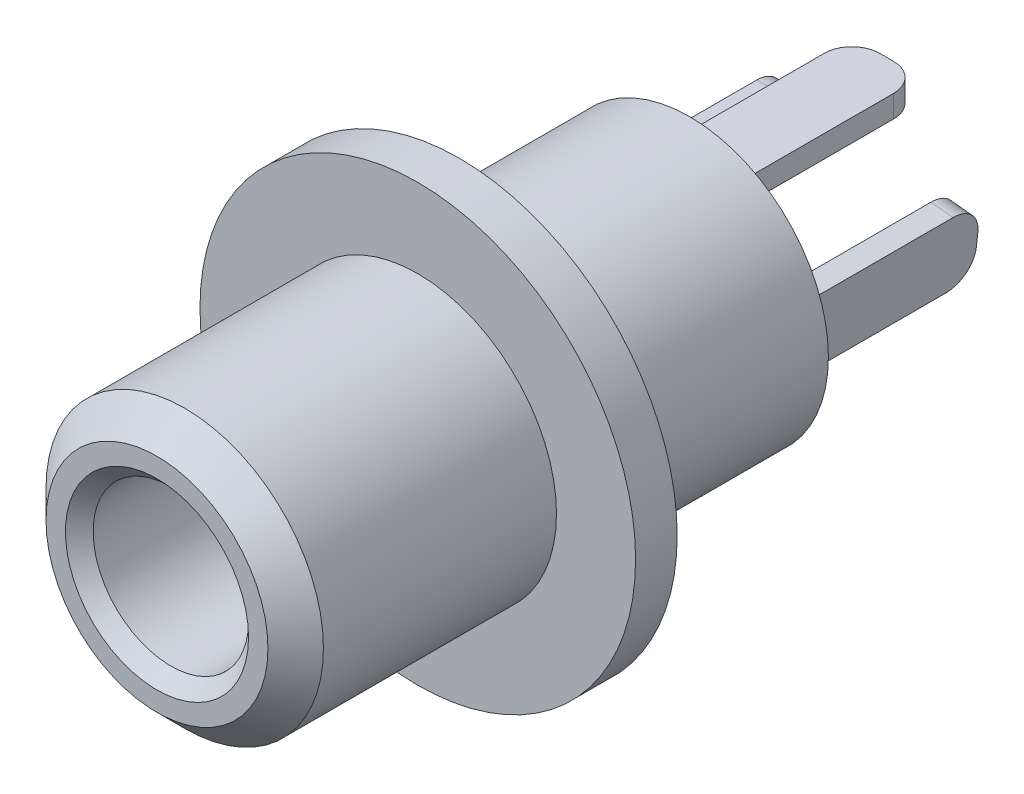
ISO-10303-21;
HEADER;
FILE_DESCRIPTION(('STEP AP214'),'2;1');
FILE_NAME('part.step','',(''),(''),'','','');
FILE_SCHEMA(('AUTOMOTIVE_DESIGN { 1 0 10303 214 1 1 1 1 }'));
ENDSEC;
DATA;
#1=APPLICATION_CONTEXT('core data for automotive mechanical design processes');
#2=APPLICATION_PROTOCOL_DEFINITION('international standard','automotive_design',2000,#1);
#3=PRODUCT_CONTEXT('',#1,'mechanical');
#4=PRODUCT('Part','Part','',(#3));
#5=PRODUCT_RELATED_PRODUCT_CATEGORY('part','',(#4));
#6=PRODUCT_DEFINITION_FORMATION('','',#4);
#7=PRODUCT_DEFINITION_CONTEXT('part definition',#1,'design');
#8=PRODUCT_DEFINITION('design','',#6,#7);
#9=PRODUCT_DEFINITION_SHAPE('','',#8);
#10=(LENGTH_UNIT() NAMED_UNIT(*) SI_UNIT(.MILLI.,.METRE.));
#11=(NAMED_UNIT(*) PLANE_ANGLE_UNIT() SI_UNIT($,.RADIAN.));
#12=(NAMED_UNIT(*) SI_UNIT($,.STERADIAN.) SOLID_ANGLE_UNIT());
#13=UNCERTAINTY_MEASURE_WITH_UNIT(LENGTH_MEASURE(1.E-05),#10,'distance_accuracy_value','');
#14=(GEOMETRIC_REPRESENTATION_CONTEXT(3) GLOBAL_UNCERTAINTY_ASSIGNED_CONTEXT((#13)) GLOBAL_UNIT_ASSIGNED_CONTEXT((#10,
#11,#12)) REPRESENTATION_CONTEXT('',''));
#15=CARTESIAN_POINT('',(0.,0.,0.));
#16=DIRECTION('',(0.,0.,1.));
#17=DIRECTION('',(1.,0.,0.));
#18=AXIS2_PLACEMENT_3D('',#15,#16,#17);
#19=CARTESIAN_POINT('',(0.,0.,4.2));
#20=DIRECTION('',(0.,0.,1.));
#21=DIRECTION('',(1.,0.,0.));
#22=AXIS2_PLACEMENT_3D('',#19,#20,#21);
#23=PLANE('',#22);
#24=CARTESIAN_POINT('',(0.,0.,4.2));
#25=DIRECTION('',(0.,0.,1.));
#26=DIRECTION('',(1.,0.,0.));
#27=AXIS2_PLACEMENT_3D('',#24,#25,#26);
#28=CIRCLE('',#27,2.8);
#29=CARTESIAN_POINT('',(2.8,0.,4.2));
#30=VERTEX_POINT('',#29);
#31=EDGE_CURVE('E179',#30,#30,#28,.T.);
#32=ORIENTED_EDGE('',*,*,#31,.T.);
#33=EDGE_LOOP('',(#32));
#34=FACE_BOUND('',#33,.T.);
#35=CARTESIAN_POINT('',(0.,0.,4.2));
#36=DIRECTION('',(0.,0.,1.));
#37=DIRECTION('',(1.,0.,0.));
#38=AXIS2_PLACEMENT_3D('',#35,#36,#37);
#39=CIRCLE('',#38,1.25);
#40=CARTESIAN_POINT('',(1.25,0.,4.2));
#41=VERTEX_POINT('',#40);
#42=EDGE_CURVE('E467',#41,#41,#39,.T.);
#43=ORIENTED_EDGE('',*,*,#42,.F.);
#44=EDGE_LOOP('',(#43));
#45=FACE_BOUND('',#44,.T.);
#46=ADVANCED_FACE('F37',(#34,#45),#23,.T.);
#47=CARTESIAN_POINT('',(0.,0.,0.));
#48=DIRECTION('',(0.,0.,1.));
#49=DIRECTION('',(1.,0.,0.));
#50=AXIS2_PLACEMENT_3D('',#47,#48,#49);
#51=PLANE('',#50);
#52=DIRECTION('',(1.,0.,0.));
#53=VECTOR('',#52,1.);
#54=CARTESIAN_POINT('',(-3.68547387231429,1.24999999999999,0.));
#55=LINE('',#54,#53);
#56=CARTESIAN_POINT('',(-3.68547387231429,1.24999999999999,0.));
#57=VERTEX_POINT('',#56);
#58=CARTESIAN_POINT('',(-2.88547387231429,1.24999999999999,0.));
#59=VERTEX_POINT('',#58);
#60=EDGE_CURVE('E195',#57,#59,#55,.T.);
#61=ORIENTED_EDGE('',*,*,#60,.F.);
#62=DIRECTION('',(0.,1.,0.));
#63=VECTOR('',#62,1.);
#64=CARTESIAN_POINT('',(-3.68547387231429,1.24999999999999,0.));
#65=LINE('',#64,#63);
#66=CARTESIAN_POINT('',(-3.68547387231429,-1.25000000000001,0.));
#67=VERTEX_POINT('',#66);
#68=EDGE_CURVE('E200',#67,#57,#65,.T.);
#69=ORIENTED_EDGE('',*,*,#68,.F.);
#70=DIRECTION('',(-1.,0.,0.));
#71=VECTOR('',#70,1.);
#72=CARTESIAN_POINT('',(-3.68547387231429,-1.25000000000001,0.));
#73=LINE('',#72,#71);
#74=CARTESIAN_POINT('',(-2.88547387231429,-1.25000000000001,0.));
#75=VERTEX_POINT('',#74);
#76=EDGE_CURVE('E209',#75,#67,#73,.T.);
#77=ORIENTED_EDGE('',*,*,#76,.F.);
#78=DIRECTION('',(0.,-1.,0.));
#79=VECTOR('',#78,1.);
#80=CARTESIAN_POINT('',(-2.88547387231429,1.24999999999999,0.));
#81=LINE('',#80,#79);
#82=EDGE_CURVE('E206',#59,#75,#81,.T.);
#83=ORIENTED_EDGE('',*,*,#82,.F.);
#84=EDGE_LOOP('',(#61,#69,#77,#83));
#85=FACE_BOUND('',#84,.T.);
#86=CARTESIAN_POINT('',(0.,0.,0.));
#87=DIRECTION('',(0.,0.,1.));
#88=DIRECTION('',(1.,0.,0.));
#89=AXIS2_PLACEMENT_3D('',#86,#87,#88);
#90=CIRCLE('',#89,5.);
#91=CARTESIAN_POINT('',(5.,0.,0.));
#92=VERTEX_POINT('',#91);
#93=EDGE_CURVE('E254',#92,#92,#90,.T.);
#94=ORIENTED_EDGE('',*,*,#93,.F.);
#95=EDGE_LOOP('',(#94));
#96=FACE_BOUND('',#95,.T.);
#97=DIRECTION('',(0.,-1.,0.));
#98=VECTOR('',#97,1.);
#99=CARTESIAN_POINT('',(1.25,3.3,0.));
#100=LINE('',#99,#98);
#101=CARTESIAN_POINT('',(1.25,3.3,0.));
#102=VERTEX_POINT('',#101);
#103=CARTESIAN_POINT('',(1.25,2.5,0.));
#104=VERTEX_POINT('',#103);
#105=EDGE_CURVE('E221',#102,#104,#100,.T.);
#106=ORIENTED_EDGE('',*,*,#105,.F.);
#107=DIRECTION('',(1.,0.,0.));
#108=VECTOR('',#107,1.);
#109=CARTESIAN_POINT('',(1.25,3.3,0.));
#110=LINE('',#109,#108);
#111=CARTESIAN_POINT('',(-1.25,3.3,0.));
#112=VERTEX_POINT('',#111);
#113=EDGE_CURVE('E226',#112,#102,#110,.T.);
#114=ORIENTED_EDGE('',*,*,#113,.F.);
#115=DIRECTION('',(0.,1.,0.));
#116=VECTOR('',#115,1.);
#117=CARTESIAN_POINT('',(-1.25,3.3,0.));
#118=LINE('',#117,#116);
#119=CARTESIAN_POINT('',(-1.25,2.5,0.));
#120=VERTEX_POINT('',#119);
#121=EDGE_CURVE('E235',#120,#112,#118,.T.);
#122=ORIENTED_EDGE('',*,*,#121,.F.);
#123=DIRECTION('',(-1.,0.,0.));
#124=VECTOR('',#123,1.);
#125=CARTESIAN_POINT('',(1.25,2.5,0.));
#126=LINE('',#125,#124);
#127=EDGE_CURVE('E232',#104,#120,#126,.T.);
#128=ORIENTED_EDGE('',*,*,#127,.F.);
#129=EDGE_LOOP('',(#106,#114,#122,#128));
#130=FACE_BOUND('',#129,.T.);
#131=DIRECTION('',(-0.994521895368273,0.104528463267653,0.));
#132=VECTOR('',#131,1.);
#133=CARTESIAN_POINT('',(3.13005934677666,-1.99266083295664,0.));
#134=LINE('',#133,#132);
#135=CARTESIAN_POINT('',(3.13005934677666,-1.99266083295664,0.));
#136=VERTEX_POINT('',#135);
#137=CARTESIAN_POINT('',(2.33444183048204,-1.90903806234252,0.));
#138=VERTEX_POINT('',#137);
#139=EDGE_CURVE('E164',#136,#138,#134,.T.);
#140=ORIENTED_EDGE('',*,*,#139,.F.);
#141=DIRECTION('',(-0.104528463267654,-0.994521895368273,0.));
#142=VECTOR('',#141,1.);
#143=CARTESIAN_POINT('',(3.13005934677666,-1.99266083295664,0.));
#144=LINE('',#143,#142);
#145=CARTESIAN_POINT('',(3.39138050494579,0.493643905464041,0.));
#146=VERTEX_POINT('',#145);
#147=EDGE_CURVE('E175',#146,#136,#144,.T.);
#148=ORIENTED_EDGE('',*,*,#147,.F.);
#149=DIRECTION('',(0.994521895368273,-0.104528463267653,0.));
#150=VECTOR('',#149,1.);
#151=CARTESIAN_POINT('',(3.39138050494579,0.493643905464041,0.));
#152=LINE('',#151,#150);
#153=CARTESIAN_POINT('',(2.59576298865117,0.577266676078164,0.));
#154=VERTEX_POINT('',#153);
#155=EDGE_CURVE('E183',#154,#146,#152,.T.);
#156=ORIENTED_EDGE('',*,*,#155,.F.);
#157=DIRECTION('',(0.104528463267654,0.994521895368273,0.));
#158=VECTOR('',#157,1.);
#159=CARTESIAN_POINT('',(2.33444183048204,-1.90903806234252,0.));
#160=LINE('',#159,#158);
#161=EDGE_CURVE('E178',#138,#154,#160,.T.);
#162=ORIENTED_EDGE('',*,*,#161,.F.);
#163=EDGE_LOOP('',(#140,#148,#156,#162));
#164=FACE_BOUND('',#163,.T.);
#165=ADVANCED_FACE('F173',(#85,#96,#130,#164),#51,.F.);
#166=CARTESIAN_POINT('',(0.,0.,9.8));
#167=DIRECTION('',(0.,0.,1.));
#168=DIRECTION('',(1.,0.,0.));
#169=AXIS2_PLACEMENT_3D('',#166,#167,#168);
#170=PLANE('',#169);
#171=CARTESIAN_POINT('',(0.,0.,9.8));
#172=DIRECTION('',(0.,0.,1.));
#173=DIRECTION('',(1.,0.,0.));
#174=AXIS2_PLACEMENT_3D('',#171,#172,#173);
#175=CIRCLE('',#174,7.85);
#176=CARTESIAN_POINT('',(7.85,0.,9.8));
#177=VERTEX_POINT('',#176);
#178=EDGE_CURVE('E250',#177,#177,#175,.T.);
#179=ORIENTED_EDGE('',*,*,#178,.T.);
#180=EDGE_LOOP('',(#179));
#181=FACE_BOUND('',#180,.T.);
#182=CARTESIAN_POINT('',(0.,0.,9.8));
#183=DIRECTION('',(0.,0.,1.));
#184=DIRECTION('',(1.,0.,0.));
#185=AXIS2_PLACEMENT_3D('',#182,#183,#184);
#186=CIRCLE('',#185,5.);
#187=CARTESIAN_POINT('',(5.,0.,9.8));
#188=VERTEX_POINT('',#187);
#189=EDGE_CURVE('E247',#188,#188,#186,.T.);
#190=ORIENTED_EDGE('',*,*,#189,.F.);
#191=EDGE_LOOP('',(#190));
#192=FACE_BOUND('',#191,.T.);
#193=ADVANCED_FACE('F340',(#181,#192),#170,.T.);
#194=CARTESIAN_POINT('',(0.,0.,9.8));
#195=DIRECTION('',(0.,0.,-1.));
#196=DIRECTION('',(-1.,0.,0.));
#197=AXIS2_PLACEMENT_3D('',#194,#195,#196);
#198=CYLINDRICAL_SURFACE('',#197,5.);
#199=ORIENTED_EDGE('',*,*,#93,.T.);
#200=EDGE_LOOP('',(#199));
#201=FACE_BOUND('',#200,.T.);
#202=CARTESIAN_POINT('',(0.,0.,8.3));
#203=DIRECTION('',(0.,0.,1.));
#204=DIRECTION('',(1.,0.,0.));
#205=AXIS2_PLACEMENT_3D('',#202,#203,#204);
#206=CIRCLE('',#205,5.);
#207=CARTESIAN_POINT('',(5.,0.,8.3));
#208=VERTEX_POINT('',#207);
#209=EDGE_CURVE('E259',#208,#208,#206,.T.);
#210=ORIENTED_EDGE('',*,*,#209,.F.);
#211=EDGE_LOOP('',(#210));
#212=FACE_BOUND('',#211,.T.);
#213=ADVANCED_FACE('F421',(#201,#212),#198,.T.);
#214=CARTESIAN_POINT('',(0.,0.,8.3));
#215=DIRECTION('',(0.,0.,1.));
#216=DIRECTION('',(1.,0.,0.));
#217=AXIS2_PLACEMENT_3D('',#214,#215,#216);
#218=PLANE('',#217);
#219=CARTESIAN_POINT('',(0.,0.,8.3));
#220=DIRECTION('',(0.,0.,1.));
#221=DIRECTION('',(1.,0.,0.));
#222=AXIS2_PLACEMENT_3D('',#219,#220,#221);
#223=CIRCLE('',#222,7.85);
#224=CARTESIAN_POINT('',(7.85,0.,8.3));
#225=VERTEX_POINT('',#224);
#226=EDGE_CURVE('E251',#225,#225,#223,.T.);
#227=ORIENTED_EDGE('',*,*,#226,.F.);
#228=EDGE_LOOP('',(#227));
#229=FACE_BOUND('',#228,.T.);
#230=ORIENTED_EDGE('',*,*,#209,.T.);
#231=EDGE_LOOP('',(#230));
#232=FACE_BOUND('',#231,.T.);
#233=ADVANCED_FACE('F418',(#229,#232),#218,.F.);
#234=CARTESIAN_POINT('',(0.,0.,8.3));
#235=DIRECTION('',(0.,0.,1.));
#236=DIRECTION('',(1.,0.,0.));
#237=AXIS2_PLACEMENT_3D('',#234,#235,#236);
#238=CYLINDRICAL_SURFACE('',#237,7.85);
#239=ORIENTED_EDGE('',*,*,#226,.T.);
#240=EDGE_LOOP('',(#239));
#241=FACE_BOUND('',#240,.T.);
#242=ORIENTED_EDGE('',*,*,#178,.F.);
#243=EDGE_LOOP('',(#242));
#244=FACE_BOUND('',#243,.T.);
#245=ADVANCED_FACE('F416',(#241,#244),#238,.T.);
#246=CARTESIAN_POINT('',(0.,0.,19.2));
#247=DIRECTION('',(0.,0.,-1.));
#248=DIRECTION('',(-1.,0.,0.));
#249=AXIS2_PLACEMENT_3D('',#246,#247,#248);
#250=CYLINDRICAL_SURFACE('',#249,5.);
#251=CARTESIAN_POINT('',(0.,0.,18.2));
#252=DIRECTION('',(0.,0.,1.));
#253=DIRECTION('',(1.,0.,0.));
#254=AXIS2_PLACEMENT_3D('',#251,#252,#253);
#255=CIRCLE('',#254,5.);
#256=CARTESIAN_POINT('',(5.,0.,18.2));
#257=VERTEX_POINT('',#256);
#258=EDGE_CURVE('E317',#257,#257,#255,.F.);
#259=ORIENTED_EDGE('',*,*,#258,.T.);
#260=EDGE_LOOP('',(#259));
#261=FACE_BOUND('',#260,.T.);
#262=ORIENTED_EDGE('',*,*,#189,.T.);
#263=EDGE_LOOP('',(#262));
#264=FACE_BOUND('',#263,.T.);
#265=ADVANCED_FACE('F412',(#261,#264),#250,.T.);
#266=CARTESIAN_POINT('',(0.,0.,19.2));
#267=DIRECTION('',(0.,0.,1.));
#268=DIRECTION('',(1.,0.,0.));
#269=AXIS2_PLACEMENT_3D('',#266,#267,#268);
#270=PLANE('',#269);
#271=CARTESIAN_POINT('',(0.,0.,19.2));
#272=DIRECTION('',(0.,0.,1.));
#273=DIRECTION('',(1.,0.,0.));
#274=AXIS2_PLACEMENT_3D('',#271,#272,#273);
#275=CIRCLE('',#274,3.3);
#276=CARTESIAN_POINT('',(3.3,0.,19.2));
#277=VERTEX_POINT('',#276);
#278=EDGE_CURVE('E11',#277,#277,#275,.F.);
#279=ORIENTED_EDGE('',*,*,#278,.T.);
#280=EDGE_LOOP('',(#279));
#281=FACE_BOUND('',#280,.T.);
#282=CARTESIAN_POINT('',(0.,0.,19.2));
#283=DIRECTION('',(0.,0.,1.));
#284=DIRECTION('',(1.,0.,0.));
#285=AXIS2_PLACEMENT_3D('',#282,#283,#284);
#286=CIRCLE('',#285,4.);
#287=CARTESIAN_POINT('',(4.,0.,19.2));
#288=VERTEX_POINT('',#287);
#289=EDGE_CURVE('E314',#288,#288,#286,.T.);
#290=ORIENTED_EDGE('',*,*,#289,.T.);
#291=EDGE_LOOP('',(#290));
#292=FACE_BOUND('',#291,.T.);
#293=ADVANCED_FACE('F408',(#281,#292),#270,.T.);
#294=CARTESIAN_POINT('',(1.25,3.3,-7.1));
#295=DIRECTION('',(-1.,0.,0.));
#296=DIRECTION('',(0.,-1.,0.));
#297=AXIS2_PLACEMENT_3D('',#294,#295,#296);
#298=PLANE('',#297);
#299=DIRECTION('',(0.,0.,1.));
#300=VECTOR('',#299,1.);
#301=CARTESIAN_POINT('',(1.25,2.5,-7.1));
#302=LINE('',#301,#300);
#303=CARTESIAN_POINT('',(1.25,2.5,-6.1));
#304=VERTEX_POINT('',#303);
#305=EDGE_CURVE('E245',#304,#104,#302,.T.);
#306=ORIENTED_EDGE('',*,*,#305,.F.);
#307=DIRECTION('',(0.,-1.,0.));
#308=VECTOR('',#307,1.);
#309=CARTESIAN_POINT('',(1.25,3.3,-6.1));
#310=LINE('',#309,#308);
#311=CARTESIAN_POINT('',(1.25,3.3,-6.1));
#312=VERTEX_POINT('',#311);
#313=EDGE_CURVE('E296',#304,#312,#310,.F.);
#314=ORIENTED_EDGE('',*,*,#313,.T.);
#315=DIRECTION('',(0.,0.,1.));
#316=VECTOR('',#315,1.);
#317=CARTESIAN_POINT('',(1.25,3.3,-7.1));
#318=LINE('',#317,#316);
#319=EDGE_CURVE('E229',#312,#102,#318,.T.);
#320=ORIENTED_EDGE('',*,*,#319,.T.);
#321=ORIENTED_EDGE('',*,*,#105,.T.);
#322=EDGE_LOOP('',(#306,#314,#320,#321));
#323=FACE_BOUND('',#322,.T.);
#324=ADVANCED_FACE('F404',(#323),#298,.F.);
#325=CARTESIAN_POINT('',(1.25,2.5,-7.1));
#326=DIRECTION('',(0.,1.,0.));
#327=DIRECTION('',(0.,0.,1.));
#328=AXIS2_PLACEMENT_3D('',#325,#326,#327);
#329=PLANE('',#328);
#330=DIRECTION('',(0.,0.,1.));
#331=VECTOR('',#330,1.);
#332=CARTESIAN_POINT('',(-1.25,2.5,-7.1));
#333=LINE('',#332,#331);
#334=CARTESIAN_POINT('',(-1.25,2.5,-6.1));
#335=VERTEX_POINT('',#334);
#336=EDGE_CURVE('E243',#335,#120,#333,.T.);
#337=ORIENTED_EDGE('',*,*,#336,.F.);
#338=CARTESIAN_POINT('',(-0.25,2.5,-6.1));
#339=DIRECTION('',(0.,1.,0.));
#340=DIRECTION('',(0.,0.,1.));
#341=AXIS2_PLACEMENT_3D('',#338,#339,#340);
#342=CIRCLE('',#341,1.);
#343=CARTESIAN_POINT('',(-0.25,2.5,-7.1));
#344=VERTEX_POINT('',#343);
#345=EDGE_CURVE('E294',#335,#344,#342,.F.);
#346=ORIENTED_EDGE('',*,*,#345,.T.);
#347=DIRECTION('',(-1.,0.,0.));
#348=VECTOR('',#347,1.);
#349=CARTESIAN_POINT('',(1.25,2.5,-7.1));
#350=LINE('',#349,#348);
#351=CARTESIAN_POINT('',(0.25,2.5,-7.1));
#352=VERTEX_POINT('',#351);
#353=EDGE_CURVE('E222',#352,#344,#350,.T.);
#354=ORIENTED_EDGE('',*,*,#353,.F.);
#355=CARTESIAN_POINT('',(0.25,2.5,-6.1));
#356=DIRECTION('',(0.,1.,0.));
#357=DIRECTION('',(0.,0.,1.));
#358=AXIS2_PLACEMENT_3D('',#355,#356,#357);
#359=CIRCLE('',#358,1.);
#360=EDGE_CURVE('E292',#352,#304,#359,.F.);
#361=ORIENTED_EDGE('',*,*,#360,.T.);
#362=ORIENTED_EDGE('',*,*,#305,.T.);
#363=ORIENTED_EDGE('',*,*,#127,.T.);
#364=EDGE_LOOP('',(#337,#346,#354,#361,#362,#363));
#365=FACE_BOUND('',#364,.T.);
#366=ADVANCED_FACE('F400',(#365),#329,.F.);
#367=CARTESIAN_POINT('',(-1.25,3.3,-7.1));
#368=DIRECTION('',(1.,0.,0.));
#369=DIRECTION('',(0.,1.,0.));
#370=AXIS2_PLACEMENT_3D('',#367,#368,#369);
#371=PLANE('',#370);
#372=DIRECTION('',(0.,0.,1.));
#373=VECTOR('',#372,1.);
#374=CARTESIAN_POINT('',(-1.25,3.3,-7.1));
#375=LINE('',#374,#373);
#376=CARTESIAN_POINT('',(-1.25,3.3,-6.1));
#377=VERTEX_POINT('',#376);
#378=EDGE_CURVE('E241',#377,#112,#375,.T.);
#379=ORIENTED_EDGE('',*,*,#378,.F.);
#380=DIRECTION('',(0.,1.,0.));
#381=VECTOR('',#380,1.);
#382=CARTESIAN_POINT('',(-1.25,2.5,-6.1));
#383=LINE('',#382,#381);
#384=EDGE_CURVE('E290',#377,#335,#383,.F.);
#385=ORIENTED_EDGE('',*,*,#384,.T.);
#386=ORIENTED_EDGE('',*,*,#336,.T.);
#387=ORIENTED_EDGE('',*,*,#121,.T.);
#388=EDGE_LOOP('',(#379,#385,#386,#387));
#389=FACE_BOUND('',#388,.T.);
#390=ADVANCED_FACE('F396',(#389),#371,.F.);
#391=CARTESIAN_POINT('',(1.25,3.3,-7.1));
#392=DIRECTION('',(0.,-1.,0.));
#393=DIRECTION('',(0.,0.,-1.));
#394=AXIS2_PLACEMENT_3D('',#391,#392,#393);
#395=PLANE('',#394);
#396=DIRECTION('',(1.,0.,0.));
#397=VECTOR('',#396,1.);
#398=CARTESIAN_POINT('',(1.25,3.3,-7.1));
#399=LINE('',#398,#397);
#400=CARTESIAN_POINT('',(-0.25,3.3,-7.1));
#401=VERTEX_POINT('',#400);
#402=CARTESIAN_POINT('',(0.25,3.3,-7.1));
#403=VERTEX_POINT('',#402);
#404=EDGE_CURVE('E225',#401,#403,#399,.T.);
#405=ORIENTED_EDGE('',*,*,#404,.F.);
#406=CARTESIAN_POINT('',(-0.25,3.3,-6.1));
#407=DIRECTION('',(0.,-1.,0.));
#408=DIRECTION('',(0.,0.,-1.));
#409=AXIS2_PLACEMENT_3D('',#406,#407,#408);
#410=CIRCLE('',#409,1.);
#411=EDGE_CURVE('E288',#401,#377,#410,.F.);
#412=ORIENTED_EDGE('',*,*,#411,.T.);
#413=ORIENTED_EDGE('',*,*,#378,.T.);
#414=ORIENTED_EDGE('',*,*,#113,.T.);
#415=ORIENTED_EDGE('',*,*,#319,.F.);
#416=CARTESIAN_POINT('',(0.25,3.3,-6.1));
#417=DIRECTION('',(0.,-1.,0.));
#418=DIRECTION('',(0.,0.,-1.));
#419=AXIS2_PLACEMENT_3D('',#416,#417,#418);
#420=CIRCLE('',#419,1.);
#421=EDGE_CURVE('E286',#312,#403,#420,.F.);
#422=ORIENTED_EDGE('',*,*,#421,.T.);
#423=EDGE_LOOP('',(#405,#412,#413,#414,#415,#422));
#424=FACE_BOUND('',#423,.T.);
#425=ADVANCED_FACE('F392',(#424),#395,.F.);
#426=CARTESIAN_POINT('',(0.,0.,-7.1));
#427=DIRECTION('',(0.,0.,-1.));
#428=DIRECTION('',(-1.,0.,0.));
#429=AXIS2_PLACEMENT_3D('',#426,#427,#428);
#430=PLANE('',#429);
#431=ORIENTED_EDGE('',*,*,#353,.T.);
#432=DIRECTION('',(0.,1.,0.));
#433=VECTOR('',#432,1.);
#434=CARTESIAN_POINT('',(-0.25,3.3,-7.1));
#435=LINE('',#434,#433);
#436=EDGE_CURVE('E283',#344,#401,#435,.T.);
#437=ORIENTED_EDGE('',*,*,#436,.T.);
#438=ORIENTED_EDGE('',*,*,#404,.T.);
#439=DIRECTION('',(0.,-1.,0.));
#440=VECTOR('',#439,1.);
#441=CARTESIAN_POINT('',(0.25,2.5,-7.1));
#442=LINE('',#441,#440);
#443=EDGE_CURVE('E280',#403,#352,#442,.T.);
#444=ORIENTED_EDGE('',*,*,#443,.T.);
#445=EDGE_LOOP('',(#431,#437,#438,#444));
#446=FACE_BOUND('',#445,.T.);
#447=ADVANCED_FACE('F388',(#446),#430,.T.);
#448=CARTESIAN_POINT('',(-3.68547387231429,1.24999999999999,-7.1));
#449=DIRECTION('',(0.,-1.,0.));
#450=DIRECTION('',(1.,0.,0.));
#451=AXIS2_PLACEMENT_3D('',#448,#449,#450);
#452=PLANE('',#451);
#453=DIRECTION('',(0.,0.,1.));
#454=VECTOR('',#453,1.);
#455=CARTESIAN_POINT('',(-2.88547387231429,1.24999999999999,-7.1));
#456=LINE('',#455,#454);
#457=CARTESIAN_POINT('',(-2.88547387231429,1.24999999999999,-6.1));
#458=VERTEX_POINT('',#457);
#459=EDGE_CURVE('E219',#458,#59,#456,.T.);
#460=ORIENTED_EDGE('',*,*,#459,.F.);
#461=DIRECTION('',(1.,0.,0.));
#462=VECTOR('',#461,1.);
#463=CARTESIAN_POINT('',(-3.68547387231429,1.24999999999999,-6.1));
#464=LINE('',#463,#462);
#465=CARTESIAN_POINT('',(-3.68547387231429,1.24999999999999,-6.1));
#466=VERTEX_POINT('',#465);
#467=EDGE_CURVE('E278',#458,#466,#464,.F.);
#468=ORIENTED_EDGE('',*,*,#467,.T.);
#469=DIRECTION('',(0.,0.,1.));
#470=VECTOR('',#469,1.);
#471=CARTESIAN_POINT('',(-3.68547387231429,1.24999999999999,-7.1));
#472=LINE('',#471,#470);
#473=EDGE_CURVE('E203',#466,#57,#472,.T.);
#474=ORIENTED_EDGE('',*,*,#473,.T.);
#475=ORIENTED_EDGE('',*,*,#60,.T.);
#476=EDGE_LOOP('',(#460,#468,#474,#475));
#477=FACE_BOUND('',#476,.T.);
#478=ADVANCED_FACE('F384',(#477),#452,.F.);
#479=CARTESIAN_POINT('',(-2.88547387231429,1.24999999999999,-7.1));
#480=DIRECTION('',(-1.,0.,0.));
#481=DIRECTION('',(0.,0.,1.));
#482=AXIS2_PLACEMENT_3D('',#479,#480,#481);
#483=PLANE('',#482);
#484=DIRECTION('',(0.,0.,1.));
#485=VECTOR('',#484,1.);
#486=CARTESIAN_POINT('',(-2.88547387231429,-1.25000000000001,-7.1));
#487=LINE('',#486,#485);
#488=CARTESIAN_POINT('',(-2.88547387231429,-1.25000000000001,-6.1));
#489=VERTEX_POINT('',#488);
#490=EDGE_CURVE('E217',#489,#75,#487,.T.);
#491=ORIENTED_EDGE('',*,*,#490,.F.);
#492=CARTESIAN_POINT('',(-2.88547387231429,-0.250000000000008,-6.1));
#493=DIRECTION('',(-1.,0.,0.));
#494=DIRECTION('',(0.,0.,1.));
#495=AXIS2_PLACEMENT_3D('',#492,#493,#494);
#496=CIRCLE('',#495,1.);
#497=CARTESIAN_POINT('',(-2.88547387231429,-0.250000000000008,-7.1));
#498=VERTEX_POINT('',#497);
#499=EDGE_CURVE('E276',#489,#498,#496,.F.);
#500=ORIENTED_EDGE('',*,*,#499,.T.);
#501=DIRECTION('',(0.,-1.,0.));
#502=VECTOR('',#501,1.);
#503=CARTESIAN_POINT('',(-2.88547387231429,1.24999999999999,-7.1));
#504=LINE('',#503,#502);
#505=CARTESIAN_POINT('',(-2.88547387231429,0.249999999999993,-7.1));
#506=VERTEX_POINT('',#505);
#507=EDGE_CURVE('E196',#506,#498,#504,.T.);
#508=ORIENTED_EDGE('',*,*,#507,.F.);
#509=CARTESIAN_POINT('',(-2.88547387231429,0.249999999999993,-6.1));
#510=DIRECTION('',(-1.,0.,0.));
#511=DIRECTION('',(0.,0.,1.));
#512=AXIS2_PLACEMENT_3D('',#509,#510,#511);
#513=CIRCLE('',#512,1.);
#514=EDGE_CURVE('E274',#506,#458,#513,.F.);
#515=ORIENTED_EDGE('',*,*,#514,.T.);
#516=ORIENTED_EDGE('',*,*,#459,.T.);
#517=ORIENTED_EDGE('',*,*,#82,.T.);
#518=EDGE_LOOP('',(#491,#500,#508,#515,#516,#517));
#519=FACE_BOUND('',#518,.T.);
#520=ADVANCED_FACE('F380',(#519),#483,.F.);
#521=CARTESIAN_POINT('',(-3.68547387231429,-1.25000000000001,-7.1));
#522=DIRECTION('',(0.,1.,0.));
#523=DIRECTION('',(0.,0.,1.));
#524=AXIS2_PLACEMENT_3D('',#521,#522,#523);
#525=PLANE('',#524);
#526=DIRECTION('',(0.,0.,1.));
#527=VECTOR('',#526,1.);
#528=CARTESIAN_POINT('',(-3.68547387231429,-1.25000000000001,-7.1));
#529=LINE('',#528,#527);
#530=CARTESIAN_POINT('',(-3.68547387231429,-1.25000000000001,-6.1));
#531=VERTEX_POINT('',#530);
#532=EDGE_CURVE('E215',#531,#67,#529,.T.);
#533=ORIENTED_EDGE('',*,*,#532,.F.);
#534=DIRECTION('',(-1.,0.,0.));
#535=VECTOR('',#534,1.);
#536=CARTESIAN_POINT('',(-2.88547387231429,-1.25000000000001,-6.1));
#537=LINE('',#536,#535);
#538=EDGE_CURVE('E272',#531,#489,#537,.F.);
#539=ORIENTED_EDGE('',*,*,#538,.T.);
#540=ORIENTED_EDGE('',*,*,#490,.T.);
#541=ORIENTED_EDGE('',*,*,#76,.T.);
#542=EDGE_LOOP('',(#533,#539,#540,#541));
#543=FACE_BOUND('',#542,.T.);
#544=ADVANCED_FACE('F376',(#543),#525,.F.);
#545=CARTESIAN_POINT('',(-3.68547387231429,1.24999999999999,-7.1));
#546=DIRECTION('',(1.,0.,0.));
#547=DIRECTION('',(0.,0.,-1.));
#548=AXIS2_PLACEMENT_3D('',#545,#546,#547);
#549=PLANE('',#548);
#550=DIRECTION('',(0.,1.,0.));
#551=VECTOR('',#550,1.);
#552=CARTESIAN_POINT('',(-3.68547387231429,1.24999999999999,-7.1));
#553=LINE('',#552,#551);
#554=CARTESIAN_POINT('',(-3.68547387231429,-0.250000000000008,-7.1));
#555=VERTEX_POINT('',#554);
#556=CARTESIAN_POINT('',(-3.68547387231429,0.249999999999993,-7.1));
#557=VERTEX_POINT('',#556);
#558=EDGE_CURVE('E199',#555,#557,#553,.T.);
#559=ORIENTED_EDGE('',*,*,#558,.F.);
#560=CARTESIAN_POINT('',(-3.68547387231429,-0.250000000000008,-6.1));
#561=DIRECTION('',(1.,0.,0.));
#562=DIRECTION('',(0.,0.,-1.));
#563=AXIS2_PLACEMENT_3D('',#560,#561,#562);
#564=CIRCLE('',#563,1.);
#565=EDGE_CURVE('E270',#555,#531,#564,.F.);
#566=ORIENTED_EDGE('',*,*,#565,.T.);
#567=ORIENTED_EDGE('',*,*,#532,.T.);
#568=ORIENTED_EDGE('',*,*,#68,.T.);
#569=ORIENTED_EDGE('',*,*,#473,.F.);
#570=CARTESIAN_POINT('',(-3.68547387231429,0.249999999999993,-6.1));
#571=DIRECTION('',(1.,0.,0.));
#572=DIRECTION('',(0.,0.,-1.));
#573=AXIS2_PLACEMENT_3D('',#570,#571,#572);
#574=CIRCLE('',#573,1.);
#575=EDGE_CURVE('E268',#466,#557,#574,.F.);
#576=ORIENTED_EDGE('',*,*,#575,.T.);
#577=EDGE_LOOP('',(#559,#566,#567,#568,#569,#576));
#578=FACE_BOUND('',#577,.T.);
#579=ADVANCED_FACE('F372',(#578),#549,.F.);
#580=CARTESIAN_POINT('',(0.,0.,-7.1));
#581=DIRECTION('',(0.,0.,-1.));
#582=DIRECTION('',(-1.,0.,0.));
#583=AXIS2_PLACEMENT_3D('',#580,#581,#582);
#584=PLANE('',#583);
#585=ORIENTED_EDGE('',*,*,#507,.T.);
#586=DIRECTION('',(-1.,0.,0.));
#587=VECTOR('',#586,1.);
#588=CARTESIAN_POINT('',(-3.68547387231429,-0.250000000000008,-7.1));
#589=LINE('',#588,#587);
#590=EDGE_CURVE('E265',#498,#555,#589,.T.);
#591=ORIENTED_EDGE('',*,*,#590,.T.);
#592=ORIENTED_EDGE('',*,*,#558,.T.);
#593=DIRECTION('',(1.,0.,0.));
#594=VECTOR('',#593,1.);
#595=CARTESIAN_POINT('',(-2.88547387231429,0.249999999999993,-7.1));
#596=LINE('',#595,#594);
#597=EDGE_CURVE('E262',#557,#506,#596,.T.);
#598=ORIENTED_EDGE('',*,*,#597,.T.);
#599=EDGE_LOOP('',(#585,#591,#592,#598));
#600=FACE_BOUND('',#599,.T.);
#601=ADVANCED_FACE('F369',(#600),#584,.T.);
#602=CARTESIAN_POINT('',(3.13005934677666,-1.99266083295664,-7.1));
#603=DIRECTION('',(0.104528463267653,0.994521895368273,0.));
#604=DIRECTION('',(-0.994521895368273,0.104528463267653,0.));
#605=AXIS2_PLACEMENT_3D('',#602,#603,#604);
#606=PLANE('',#605);
#607=DIRECTION('',(0.,0.,1.));
#608=VECTOR('',#607,1.);
#609=CARTESIAN_POINT('',(2.33444183048204,-1.90903806234252,-7.1));
#610=LINE('',#609,#608);
#611=CARTESIAN_POINT('',(2.33444183048204,-1.90903806234252,-6.1));
#612=VERTEX_POINT('',#611);
#613=EDGE_CURVE('E193',#612,#138,#610,.T.);
#614=ORIENTED_EDGE('',*,*,#613,.F.);
#615=DIRECTION('',(-0.994521895368273,0.104528463267653,0.));
#616=VECTOR('',#615,1.);
#617=CARTESIAN_POINT('',(3.13005934677666,-1.99266083295664,-6.1));
#618=LINE('',#617,#616);
#619=CARTESIAN_POINT('',(3.13005934677666,-1.99266083295664,-6.1));
#620=VERTEX_POINT('',#619);
#621=EDGE_CURVE('E60',#612,#620,#618,.F.);
#622=ORIENTED_EDGE('',*,*,#621,.T.);
#623=DIRECTION('',(0.,0.,1.));
#624=VECTOR('',#623,1.);
#625=CARTESIAN_POINT('',(3.13005934677666,-1.99266083295664,-7.1));
#626=LINE('',#625,#624);
#627=EDGE_CURVE('E161',#620,#136,#626,.T.);
#628=ORIENTED_EDGE('',*,*,#627,.T.);
#629=ORIENTED_EDGE('',*,*,#139,.T.);
#630=EDGE_LOOP('',(#614,#622,#628,#629));
#631=FACE_BOUND('',#630,.T.);
#632=ADVANCED_FACE('F163',(#631),#606,.F.);
#633=CARTESIAN_POINT('',(2.33444183048204,-1.90903806234252,-7.1));
#634=DIRECTION('',(0.994521895368273,-0.104528463267654,0.));
#635=DIRECTION('',(0.104528463267654,0.994521895368273,0.));
#636=AXIS2_PLACEMENT_3D('',#633,#634,#635);
#637=PLANE('',#636);
#638=DIRECTION('',(0.104528463267654,0.994521895368273,0.));
#639=VECTOR('',#638,1.);
#640=CARTESIAN_POINT('',(2.33444183048204,-1.90903806234252,-7.1));
#641=LINE('',#640,#639);
#642=CARTESIAN_POINT('',(2.43897029374969,-0.914516166974248,-7.1));
#643=VERTEX_POINT('',#642);
#644=CARTESIAN_POINT('',(2.49123452538352,-0.41725521929011,-7.1));
#645=VERTEX_POINT('',#644);
#646=EDGE_CURVE('E182',#643,#645,#641,.T.);
#647=ORIENTED_EDGE('',*,*,#646,.F.);
#648=CARTESIAN_POINT('',(2.43897029374969,-0.914516166974248,-6.1));
#649=DIRECTION('',(0.994521895368273,-0.104528463267654,0.));
#650=DIRECTION('',(0.104528463267654,0.994521895368273,0.));
#651=AXIS2_PLACEMENT_3D('',#648,#649,#650);
#652=CIRCLE('',#651,1.);
#653=EDGE_CURVE('E306',#643,#612,#652,.F.);
#654=ORIENTED_EDGE('',*,*,#653,.T.);
#655=ORIENTED_EDGE('',*,*,#613,.T.);
#656=ORIENTED_EDGE('',*,*,#161,.T.);
#657=DIRECTION('',(0.,0.,1.));
#658=VECTOR('',#657,1.);
#659=CARTESIAN_POINT('',(2.59576298865117,0.577266676078164,-7.1));
#660=LINE('',#659,#658);
#661=CARTESIAN_POINT('',(2.59576298865117,0.577266676078164,-6.1));
#662=VERTEX_POINT('',#661);
#663=EDGE_CURVE('E191',#662,#154,#660,.T.);
#664=ORIENTED_EDGE('',*,*,#663,.F.);
#665=CARTESIAN_POINT('',(2.49123452538352,-0.41725521929011,-6.1));
#666=DIRECTION('',(0.994521895368273,-0.104528463267654,0.));
#667=DIRECTION('',(0.104528463267654,0.994521895368273,0.));
#668=AXIS2_PLACEMENT_3D('',#665,#666,#667);
#669=CIRCLE('',#668,1.);
#670=EDGE_CURVE('E304',#662,#645,#669,.F.);
#671=ORIENTED_EDGE('',*,*,#670,.T.);
#672=EDGE_LOOP('',(#647,#654,#655,#656,#664,#671));
#673=FACE_BOUND('',#672,.T.);
#674=ADVANCED_FACE('F362',(#673),#637,.F.);
#675=CARTESIAN_POINT('',(3.39138050494579,0.493643905464041,-7.1));
#676=DIRECTION('',(-0.104528463267653,-0.994521895368273,0.));
#677=DIRECTION('',(0.994521895368273,-0.104528463267653,0.));
#678=AXIS2_PLACEMENT_3D('',#675,#676,#677);
#679=PLANE('',#678);
#680=DIRECTION('',(0.,0.,1.));
#681=VECTOR('',#680,1.);
#682=CARTESIAN_POINT('',(3.39138050494579,0.493643905464041,-7.1));
#683=LINE('',#682,#681);
#684=CARTESIAN_POINT('',(3.39138050494579,0.493643905464041,-6.1));
#685=VERTEX_POINT('',#684);
#686=EDGE_CURVE('E167',#685,#146,#683,.T.);
#687=ORIENTED_EDGE('',*,*,#686,.F.);
#688=DIRECTION('',(0.994521895368273,-0.104528463267653,0.));
#689=VECTOR('',#688,1.);
#690=CARTESIAN_POINT('',(2.59576298865117,0.577266676078164,-6.1));
#691=LINE('',#690,#689);
#692=EDGE_CURVE('E312',#685,#662,#691,.F.);
#693=ORIENTED_EDGE('',*,*,#692,.T.);
#694=ORIENTED_EDGE('',*,*,#663,.T.);
#695=ORIENTED_EDGE('',*,*,#155,.T.);
#696=EDGE_LOOP('',(#687,#693,#694,#695));
#697=FACE_BOUND('',#696,.T.);
#698=ADVANCED_FACE('F359',(#697),#679,.F.);
#699=CARTESIAN_POINT('',(3.13005934677666,-1.99266083295664,-7.1));
#700=DIRECTION('',(-0.994521895368273,0.104528463267654,0.));
#701=DIRECTION('',(-0.104528463267654,-0.994521895368274,0.));
#702=AXIS2_PLACEMENT_3D('',#699,#700,#701);
#703=PLANE('',#702);
#704=ORIENTED_EDGE('',*,*,#627,.F.);
#705=CARTESIAN_POINT('',(3.23458781004431,-0.998138937588371,-6.1));
#706=DIRECTION('',(-0.994521895368273,0.104528463267654,0.));
#707=DIRECTION('',(-0.104528463267654,-0.994521895368274,0.));
#708=AXIS2_PLACEMENT_3D('',#705,#706,#707);
#709=CIRCLE('',#708,1.);
#710=CARTESIAN_POINT('',(3.23458781004431,-0.99813893758837,-7.1));
#711=VERTEX_POINT('',#710);
#712=EDGE_CURVE('E310',#620,#711,#709,.F.);
#713=ORIENTED_EDGE('',*,*,#712,.T.);
#714=DIRECTION('',(-0.104528463267654,-0.994521895368273,0.));
#715=VECTOR('',#714,1.);
#716=CARTESIAN_POINT('',(3.13005934677666,-1.99266083295664,-7.1));
#717=LINE('',#716,#715);
#718=CARTESIAN_POINT('',(3.28685204167814,-0.500877989904232,-7.1));
#719=VERTEX_POINT('',#718);
#720=EDGE_CURVE('E168',#719,#711,#717,.T.);
#721=ORIENTED_EDGE('',*,*,#720,.F.);
#722=CARTESIAN_POINT('',(3.28685204167814,-0.500877989904233,-6.1));
#723=DIRECTION('',(-0.994521895368273,0.104528463267654,0.));
#724=DIRECTION('',(-0.104528463267654,-0.994521895368274,0.));
#725=AXIS2_PLACEMENT_3D('',#722,#723,#724);
#726=CIRCLE('',#725,1.);
#727=EDGE_CURVE('E52',#719,#685,#726,.F.);
#728=ORIENTED_EDGE('',*,*,#727,.T.);
#729=ORIENTED_EDGE('',*,*,#686,.T.);
#730=ORIENTED_EDGE('',*,*,#147,.T.);
#731=EDGE_LOOP('',(#704,#713,#721,#728,#729,#730));
#732=FACE_BOUND('',#731,.T.);
#733=ADVANCED_FACE('F181',(#732),#703,.F.);
#734=CARTESIAN_POINT('',(0.,0.,-7.1));
#735=DIRECTION('',(0.,0.,-1.));
#736=DIRECTION('',(-1.,0.,0.));
#737=AXIS2_PLACEMENT_3D('',#734,#735,#736);
#738=PLANE('',#737);
#739=ORIENTED_EDGE('',*,*,#720,.T.);
#740=DIRECTION('',(-0.994521895368273,0.104528463267653,0.));
#741=VECTOR('',#740,1.);
#742=CARTESIAN_POINT('',(2.43897029374969,-0.914516166974248,-7.1));
#743=LINE('',#742,#741);
#744=EDGE_CURVE('E301',#711,#643,#743,.T.);
#745=ORIENTED_EDGE('',*,*,#744,.T.);
#746=ORIENTED_EDGE('',*,*,#646,.T.);
#747=DIRECTION('',(0.994521895368273,-0.104528463267653,0.));
#748=VECTOR('',#747,1.);
#749=CARTESIAN_POINT('',(3.28685204167814,-0.500877989904233,-7.1));
#750=LINE('',#749,#748);
#751=EDGE_CURVE('E298',#645,#719,#750,.T.);
#752=ORIENTED_EDGE('',*,*,#751,.T.);
#753=EDGE_LOOP('',(#739,#745,#746,#752));
#754=FACE_BOUND('',#753,.T.);
#755=ADVANCED_FACE('F352',(#754),#738,.T.);
#756=CARTESIAN_POINT('',(0.,-0.250000000000008,-6.1));
#757=DIRECTION('',(1.,0.,0.));
#758=DIRECTION('',(0.,0.,-1.));
#759=AXIS2_PLACEMENT_3D('',#756,#757,#758);
#760=CYLINDRICAL_SURFACE('',#759,1.);
#761=ORIENTED_EDGE('',*,*,#499,.F.);
#762=ORIENTED_EDGE('',*,*,#538,.F.);
#763=ORIENTED_EDGE('',*,*,#565,.F.);
#764=ORIENTED_EDGE('',*,*,#590,.F.);
#765=EDGE_LOOP('',(#761,#762,#763,#764));
#766=FACE_BOUND('',#765,.T.);
#767=ADVANCED_FACE('F355',(#766),#760,.T.);
#768=CARTESIAN_POINT('',(0.,0.249999999999994,-6.1));
#769=DIRECTION('',(-1.,0.,0.));
#770=DIRECTION('',(0.,-1.,0.));
#771=AXIS2_PLACEMENT_3D('',#768,#769,#770);
#772=CYLINDRICAL_SURFACE('',#771,1.);
#773=ORIENTED_EDGE('',*,*,#575,.F.);
#774=ORIENTED_EDGE('',*,*,#467,.F.);
#775=ORIENTED_EDGE('',*,*,#514,.F.);
#776=ORIENTED_EDGE('',*,*,#597,.F.);
#777=EDGE_LOOP('',(#773,#774,#775,#776));
#778=FACE_BOUND('',#777,.T.);
#779=ADVANCED_FACE('F434',(#778),#772,.T.);
#780=CARTESIAN_POINT('',(-0.250000000000001,0.,-6.1));
#781=DIRECTION('',(0.,-1.,0.));
#782=DIRECTION('',(1.,0.,0.));
#783=AXIS2_PLACEMENT_3D('',#780,#781,#782);
#784=CYLINDRICAL_SURFACE('',#783,1.);
#785=ORIENTED_EDGE('',*,*,#345,.F.);
#786=ORIENTED_EDGE('',*,*,#384,.F.);
#787=ORIENTED_EDGE('',*,*,#411,.F.);
#788=ORIENTED_EDGE('',*,*,#436,.F.);
#789=EDGE_LOOP('',(#785,#786,#787,#788));
#790=FACE_BOUND('',#789,.T.);
#791=ADVANCED_FACE('F438',(#790),#784,.T.);
#792=CARTESIAN_POINT('',(0.249999999999998,0.,-6.1));
#793=DIRECTION('',(0.,1.,0.));
#794=DIRECTION('',(-1.,0.,0.));
#795=AXIS2_PLACEMENT_3D('',#792,#793,#794);
#796=CYLINDRICAL_SURFACE('',#795,1.);
#797=ORIENTED_EDGE('',*,*,#421,.F.);
#798=ORIENTED_EDGE('',*,*,#313,.F.);
#799=ORIENTED_EDGE('',*,*,#360,.F.);
#800=ORIENTED_EDGE('',*,*,#443,.F.);
#801=EDGE_LOOP('',(#797,#798,#799,#800));
#802=FACE_BOUND('',#801,.T.);
#803=ADVANCED_FACE('F442',(#802),#796,.T.);
#804=CARTESIAN_POINT('',(-0.0684206249491933,-0.6509787619523,-6.1));
#805=DIRECTION('',(0.994521895368273,-0.104528463267653,0.));
#806=DIRECTION('',(0.104528463267653,0.994521895368273,0.));
#807=AXIS2_PLACEMENT_3D('',#804,#805,#806);
#808=CYLINDRICAL_SURFACE('',#807,1.);
#809=ORIENTED_EDGE('',*,*,#712,.F.);
#810=ORIENTED_EDGE('',*,*,#621,.F.);
#811=ORIENTED_EDGE('',*,*,#653,.F.);
#812=ORIENTED_EDGE('',*,*,#744,.F.);
#813=EDGE_LOOP('',(#809,#810,#811,#812));
#814=FACE_BOUND('',#813,.T.);
#815=ADVANCED_FACE('F446',(#814),#808,.T.);
#816=CARTESIAN_POINT('',(-0.0161563933153664,-0.153717814268162,-6.1));
#817=DIRECTION('',(-0.994521895368273,0.104528463267653,0.));
#818=DIRECTION('',(-0.104528463267653,-0.994521895368273,0.));
#819=AXIS2_PLACEMENT_3D('',#816,#817,#818);
#820=CYLINDRICAL_SURFACE('',#819,1.);
#821=ORIENTED_EDGE('',*,*,#670,.F.);
#822=ORIENTED_EDGE('',*,*,#692,.F.);
#823=ORIENTED_EDGE('',*,*,#727,.F.);
#824=ORIENTED_EDGE('',*,*,#751,.F.);
#825=EDGE_LOOP('',(#821,#822,#823,#824));
#826=FACE_BOUND('',#825,.T.);
#827=ADVANCED_FACE('F351',(#826),#820,.T.);
#828=CARTESIAN_POINT('',(0.,0.,4.2));
#829=DIRECTION('',(0.,0.,1.));
#830=DIRECTION('',(1.,0.,0.));
#831=AXIS2_PLACEMENT_3D('',#828,#829,#830);
#832=CYLINDRICAL_SURFACE('',#831,2.8);
#833=CARTESIAN_POINT('',(0.,0.,18.7));
#834=DIRECTION('',(0.,0.,1.));
#835=DIRECTION('',(1.,0.,0.));
#836=AXIS2_PLACEMENT_3D('',#833,#834,#835);
#837=CIRCLE('',#836,2.8);
#838=CARTESIAN_POINT('',(2.8,0.,18.7));
#839=VERTEX_POINT('',#838);
#840=EDGE_CURVE('E45',#839,#839,#837,.T.);
#841=ORIENTED_EDGE('',*,*,#840,.T.);
#842=EDGE_LOOP('',(#841));
#843=FACE_BOUND('',#842,.T.);
#844=ORIENTED_EDGE('',*,*,#31,.F.);
#845=EDGE_LOOP('',(#844));
#846=FACE_BOUND('',#845,.T.);
#847=ADVANCED_FACE('F322',(#843,#846),#832,.F.);
#848=CARTESIAN_POINT('',(0.,0.,12.2));
#849=DIRECTION('',(0.,0.,-1.));
#850=DIRECTION('',(-1.,0.,0.));
#851=AXIS2_PLACEMENT_3D('',#848,#849,#850);
#852=CYLINDRICAL_SURFACE('',#851,1.25);
#853=CARTESIAN_POINT('',(0.,0.,12.2));
#854=DIRECTION('',(0.,0.,1.));
#855=DIRECTION('',(1.,0.,0.));
#856=AXIS2_PLACEMENT_3D('',#853,#854,#855);
#857=CIRCLE('',#856,1.25);
#858=CARTESIAN_POINT('',(1.25,0.,12.2));
#859=VERTEX_POINT('',#858);
#860=EDGE_CURVE('E466',#859,#859,#857,.T.);
#861=ORIENTED_EDGE('',*,*,#860,.F.);
#862=EDGE_LOOP('',(#861));
#863=FACE_BOUND('',#862,.T.);
#864=ORIENTED_EDGE('',*,*,#42,.T.);
#865=EDGE_LOOP('',(#864));
#866=FACE_BOUND('',#865,.T.);
#867=ADVANCED_FACE('F347',(#863,#866),#852,.T.);
#868=CARTESIAN_POINT('',(0.,0.,12.2));
#869=DIRECTION('',(0.,0.,1.));
#870=DIRECTION('',(1.,0.,0.));
#871=AXIS2_PLACEMENT_3D('',#868,#869,#870);
#872=PLANE('',#871);
#873=ORIENTED_EDGE('',*,*,#860,.T.);
#874=EDGE_LOOP('',(#873));
#875=FACE_BOUND('',#874,.T.);
#876=ADVANCED_FACE('F331',(#875),#872,.T.);
#877=CARTESIAN_POINT('',(0.,0.,19.2));
#878=DIRECTION('',(0.,0.,-1.));
#879=DIRECTION('',(-1.,0.,0.));
#880=AXIS2_PLACEMENT_3D('',#877,#878,#879);
#881=CONICAL_SURFACE('',#880,4.,0.785398163397446);
#882=ORIENTED_EDGE('',*,*,#258,.F.);
#883=EDGE_LOOP('',(#882));
#884=FACE_BOUND('',#883,.T.);
#885=ORIENTED_EDGE('',*,*,#289,.F.);
#886=EDGE_LOOP('',(#885));
#887=FACE_BOUND('',#886,.T.);
#888=ADVANCED_FACE('F326',(#884,#887),#881,.T.);
#889=CARTESIAN_POINT('',(0.,0.,18.7));
#890=DIRECTION('',(0.,0.,1.));
#891=DIRECTION('',(1.,0.,0.));
#892=AXIS2_PLACEMENT_3D('',#889,#890,#891);
#893=CONICAL_SURFACE('',#892,2.8,0.785398163397453);
#894=ORIENTED_EDGE('',*,*,#278,.F.);
#895=EDGE_LOOP('',(#894));
#896=FACE_BOUND('',#895,.T.);
#897=ORIENTED_EDGE('',*,*,#840,.F.);
#898=EDGE_LOOP('',(#897));
#899=FACE_BOUND('',#898,.T.);
#900=ADVANCED_FACE('F39',(#896,#899),#893,.F.);
#901=CLOSED_SHELL('',(#46,#165,#193,#213,#233,#245,#265,#293,#324,#366,#390,#425,#447,#478,#520,
#544,#579,#601,#632,#674,#698,#733,#755,#767,#779,#791,#803,#815,#827,#847,#867,#876,#888,#900));
#902=MANIFOLD_SOLID_BREP('B2',#901);
#903=ADVANCED_BREP_SHAPE_REPRESENTATION('',(#18,#902),#14);
#904=SHAPE_DEFINITION_REPRESENTATION(#9,#903);
ENDSEC;
END-ISO-10303-21;
